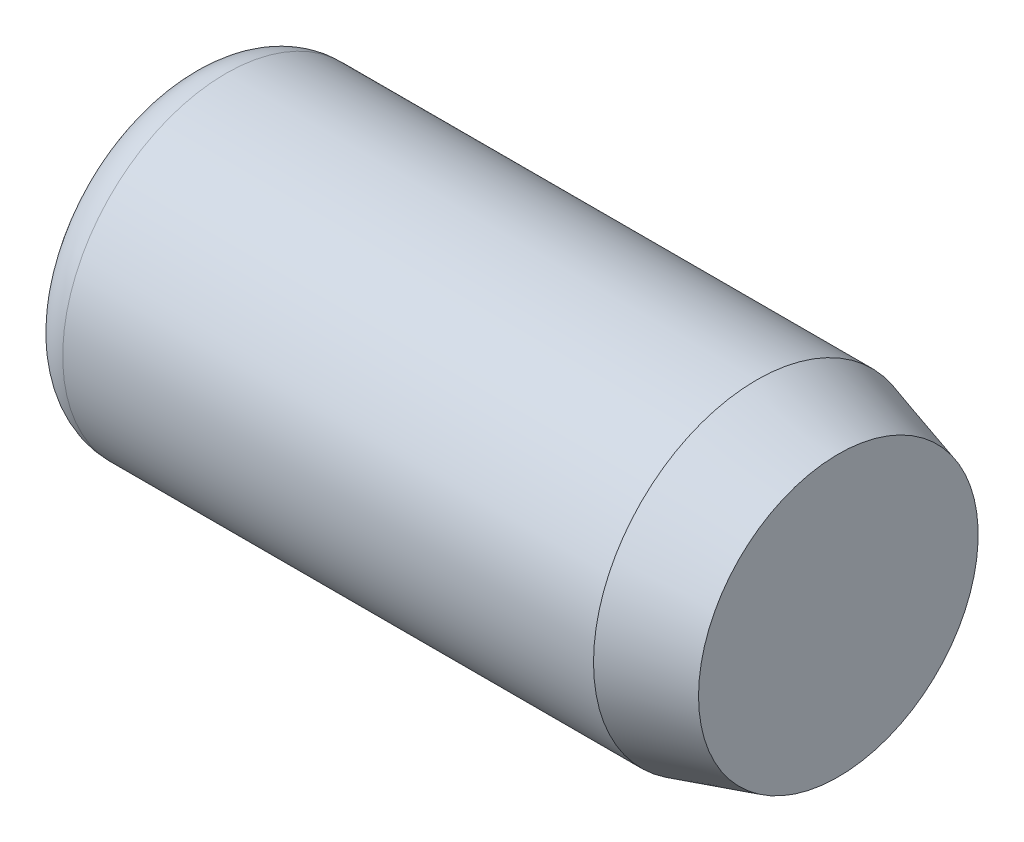
ISO-10303-21;
HEADER;
FILE_DESCRIPTION(('STEP AP214'),'2;1');
FILE_NAME('part.step','',(''),(''),'','','');
FILE_SCHEMA(('AUTOMOTIVE_DESIGN { 1 0 10303 214 1 1 1 1 }'));
ENDSEC;
DATA;
#1=APPLICATION_CONTEXT('core data for automotive mechanical design processes');
#2=APPLICATION_PROTOCOL_DEFINITION('international standard','automotive_design',2000,#1);
#3=PRODUCT_CONTEXT('',#1,'mechanical');
#4=PRODUCT('Part','Part','',(#3));
#5=PRODUCT_RELATED_PRODUCT_CATEGORY('part','',(#4));
#6=PRODUCT_DEFINITION_FORMATION('','',#4);
#7=PRODUCT_DEFINITION_CONTEXT('part definition',#1,'design');
#8=PRODUCT_DEFINITION('design','',#6,#7);
#9=PRODUCT_DEFINITION_SHAPE('','',#8);
#10=(LENGTH_UNIT() NAMED_UNIT(*) SI_UNIT(.MILLI.,.METRE.));
#11=(NAMED_UNIT(*) PLANE_ANGLE_UNIT() SI_UNIT($,.RADIAN.));
#12=(NAMED_UNIT(*) SI_UNIT($,.STERADIAN.) SOLID_ANGLE_UNIT());
#13=UNCERTAINTY_MEASURE_WITH_UNIT(LENGTH_MEASURE(1.E-05),#10,'distance_accuracy_value','');
#14=(GEOMETRIC_REPRESENTATION_CONTEXT(3) GLOBAL_UNCERTAINTY_ASSIGNED_CONTEXT((#13)) GLOBAL_UNIT_ASSIGNED_CONTEXT((#10,
#11,#12)) REPRESENTATION_CONTEXT('',''));
#15=CARTESIAN_POINT('',(0.,0.,0.));
#16=DIRECTION('',(0.,0.,1.));
#17=DIRECTION('',(1.,0.,0.));
#18=AXIS2_PLACEMENT_3D('',#15,#16,#17);
#19=CARTESIAN_POINT('',(0.,1.1938,0.));
#20=DIRECTION('',(-1.,0.,0.));
#21=DIRECTION('',(0.,0.,1.));
#22=AXIS2_PLACEMENT_3D('',#19,#20,#21);
#23=PLANE('',#22);
#24=CARTESIAN_POINT('',(0.,0.,0.));
#25=DIRECTION('',(1.,0.,0.));
#26=DIRECTION('',(0.,0.,-1.));
#27=AXIS2_PLACEMENT_3D('',#24,#25,#26);
#28=CIRCLE('',#27,2.38759999999998);
#29=CARTESIAN_POINT('',(0.,0.,-2.38759999999998));
#30=VERTEX_POINT('',#29);
#31=CARTESIAN_POINT('',(0.,2.38759999999998,0.));
#32=VERTEX_POINT('',#31);
#33=EDGE_CURVE('E43',#30,#32,#28,.T.);
#34=ORIENTED_EDGE('',*,*,#33,.F.);
#35=CARTESIAN_POINT('',(0.,0.,0.));
#36=DIRECTION('',(1.,0.,0.));
#37=DIRECTION('',(0.,0.,1.));
#38=AXIS2_PLACEMENT_3D('',#35,#36,#37);
#39=CIRCLE('',#38,2.38759999999998);
#40=CARTESIAN_POINT('',(0.,0.,2.38759999999998));
#41=VERTEX_POINT('',#40);
#42=EDGE_CURVE('E45',#41,#30,#39,.T.);
#43=ORIENTED_EDGE('',*,*,#42,.F.);
#44=CARTESIAN_POINT('',(0.,0.,0.));
#45=DIRECTION('',(1.,0.,0.));
#46=DIRECTION('',(0.,1.,0.));
#47=AXIS2_PLACEMENT_3D('',#44,#45,#46);
#48=CIRCLE('',#47,2.38759999999998);
#49=EDGE_CURVE('E37',#32,#41,#48,.T.);
#50=ORIENTED_EDGE('',*,*,#49,.F.);
#51=EDGE_LOOP('',(#34,#43,#50));
#52=FACE_BOUND('',#51,.T.);
#53=ADVANCED_FACE('F17',(#52),#23,.T.);
#54=CARTESIAN_POINT('',(12.7,1.35989585005397,0.));
#55=DIRECTION('',(1.,0.,0.));
#56=DIRECTION('',(0.,0.,-1.));
#57=AXIS2_PLACEMENT_3D('',#54,#55,#56);
#58=PLANE('',#57);
#59=CARTESIAN_POINT('',(12.7000000000521,0.,0.));
#60=DIRECTION('',(-1.,0.,0.));
#61=DIRECTION('',(0.,0.,1.));
#62=AXIS2_PLACEMENT_3D('',#59,#60,#61);
#63=CIRCLE('',#62,2.7197917003802);
#64=CARTESIAN_POINT('',(12.7000000000521,0.,2.7197917003802));
#65=VERTEX_POINT('',#64);
#66=EDGE_CURVE('E53',#65,#65,#63,.T.);
#67=ORIENTED_EDGE('',*,*,#66,.F.);
#68=EDGE_LOOP('',(#67));
#69=FACE_BOUND('',#68,.T.);
#70=ADVANCED_FACE('F66',(#69),#58,.T.);
#71=CARTESIAN_POINT('',(0.7874,0.,0.));
#72=DIRECTION('',(1.,0.,0.));
#73=DIRECTION('',(0.,0.,-1.));
#74=AXIS2_PLACEMENT_3D('',#71,#72,#73);
#75=TOROIDAL_SURFACE('',#74,2.38759999999998,0.7874);
#76=CARTESIAN_POINT('',(0.7874,0.,0.));
#77=DIRECTION('',(1.,0.,0.));
#78=DIRECTION('',(0.,1.,0.));
#79=AXIS2_PLACEMENT_3D('',#76,#77,#78);
#80=CIRCLE('',#79,3.17500000000005);
#81=CARTESIAN_POINT('',(0.7874,3.17500000000005,0.));
#82=VERTEX_POINT('',#81);
#83=EDGE_CURVE('E29',#82,#82,#80,.T.);
#84=ORIENTED_EDGE('',*,*,#83,.F.);
#85=EDGE_LOOP('',(#84));
#86=FACE_BOUND('',#85,.T.);
#87=ORIENTED_EDGE('',*,*,#42,.T.);
#88=ORIENTED_EDGE('',*,*,#33,.T.);
#89=ORIENTED_EDGE('',*,*,#49,.T.);
#90=EDGE_LOOP('',(#87,#88,#89));
#91=FACE_BOUND('',#90,.T.);
#92=ADVANCED_FACE('F49',(#86,#91),#75,.T.);
#93=CARTESIAN_POINT('',(11.112500000138,0.,0.));
#94=DIRECTION('',(-1.,0.,0.));
#95=DIRECTION('',(0.,0.,1.));
#96=AXIS2_PLACEMENT_3D('',#93,#94,#95);
#97=CONICAL_SURFACE('',#96,3.17499999968618,0.27925267999226);
#98=ORIENTED_EDGE('',*,*,#66,.T.);
#99=EDGE_LOOP('',(#98));
#100=FACE_BOUND('',#99,.T.);
#101=CARTESIAN_POINT('',(11.1125,0.,0.));
#102=DIRECTION('',(1.,0.,0.));
#103=DIRECTION('',(0.,1.,0.));
#104=AXIS2_PLACEMENT_3D('',#101,#102,#103);
#105=CIRCLE('',#104,3.17500000000005);
#106=CARTESIAN_POINT('',(11.1125,3.17500000000005,0.));
#107=VERTEX_POINT('',#106);
#108=EDGE_CURVE('E11',#107,#107,#105,.F.);
#109=ORIENTED_EDGE('',*,*,#108,.F.);
#110=EDGE_LOOP('',(#109));
#111=FACE_BOUND('',#110,.T.);
#112=ADVANCED_FACE('F65',(#100,#111),#97,.T.);
#113=CARTESIAN_POINT('',(0.7874,0.,0.));
#114=DIRECTION('',(1.,0.,0.));
#115=DIRECTION('',(0.,0.,-1.));
#116=AXIS2_PLACEMENT_3D('',#113,#114,#115);
#117=CYLINDRICAL_SURFACE('',#116,3.17500000000005);
#118=ORIENTED_EDGE('',*,*,#83,.T.);
#119=EDGE_LOOP('',(#118));
#120=FACE_BOUND('',#119,.T.);
#121=ORIENTED_EDGE('',*,*,#108,.T.);
#122=EDGE_LOOP('',(#121));
#123=FACE_BOUND('',#122,.T.);
#124=ADVANCED_FACE('F19',(#120,#123),#117,.T.);
#125=CLOSED_SHELL('',(#53,#70,#92,#112,#124));
#126=MANIFOLD_SOLID_BREP('B1',#125);
#127=ADVANCED_BREP_SHAPE_REPRESENTATION('',(#18,#126),#14);
#128=SHAPE_DEFINITION_REPRESENTATION(#9,#127);
ENDSEC;
END-ISO-10303-21;
